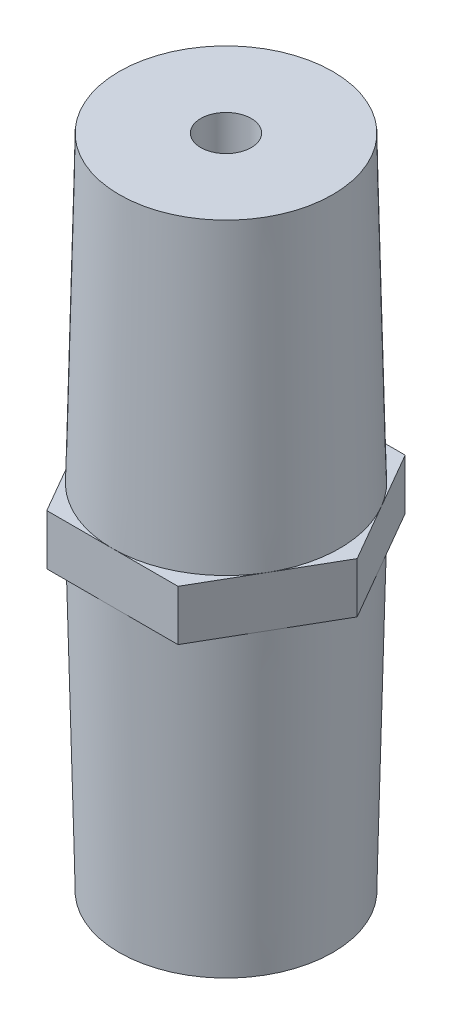
ISO-10303-21;
HEADER;
FILE_DESCRIPTION(('STEP AP214'),'2;1');
FILE_NAME('part.step','',(''),(''),'','','');
FILE_SCHEMA(('AUTOMOTIVE_DESIGN { 1 0 10303 214 1 1 1 1 }'));
ENDSEC;
DATA;
#1=APPLICATION_CONTEXT('core data for automotive mechanical design processes');
#2=APPLICATION_PROTOCOL_DEFINITION('international standard','automotive_design',2000,#1);
#3=PRODUCT_CONTEXT('',#1,'mechanical');
#4=PRODUCT('Part','Part','',(#3));
#5=PRODUCT_RELATED_PRODUCT_CATEGORY('part','',(#4));
#6=PRODUCT_DEFINITION_FORMATION('','',#4);
#7=PRODUCT_DEFINITION_CONTEXT('part definition',#1,'design');
#8=PRODUCT_DEFINITION('design','',#6,#7);
#9=PRODUCT_DEFINITION_SHAPE('','',#8);
#10=(LENGTH_UNIT() NAMED_UNIT(*) SI_UNIT(.MILLI.,.METRE.));
#11=(NAMED_UNIT(*) PLANE_ANGLE_UNIT() SI_UNIT($,.RADIAN.));
#12=(NAMED_UNIT(*) SI_UNIT($,.STERADIAN.) SOLID_ANGLE_UNIT());
#13=UNCERTAINTY_MEASURE_WITH_UNIT(LENGTH_MEASURE(1.E-05),#10,'distance_accuracy_value','');
#14=(GEOMETRIC_REPRESENTATION_CONTEXT(3) GLOBAL_UNCERTAINTY_ASSIGNED_CONTEXT((#13)) GLOBAL_UNIT_ASSIGNED_CONTEXT((#10,
#11,#12)) REPRESENTATION_CONTEXT('',''));
#15=CARTESIAN_POINT('',(0.,0.,0.));
#16=DIRECTION('',(0.,0.,1.));
#17=DIRECTION('',(1.,0.,0.));
#18=AXIS2_PLACEMENT_3D('',#15,#16,#17);
#19=CARTESIAN_POINT('',(0.,-1.5875,0.));
#20=DIRECTION('',(0.,-1.,0.));
#21=DIRECTION('',(0.,0.,1.));
#22=AXIS2_PLACEMENT_3D('',#19,#20,#21);
#23=PLANE('',#22);
#24=DIRECTION('',(1.,0.,0.));
#25=VECTOR('',#24,1.);
#26=CARTESIAN_POINT('',(-4.12444598552339,-1.5875,7.14375));
#27=LINE('',#26,#25);
#28=CARTESIAN_POINT('',(0.,-1.5875,7.14375));
#29=VERTEX_POINT('',#28);
#30=CARTESIAN_POINT('',(4.12444598552339,-1.5875,7.14375));
#31=VERTEX_POINT('',#30);
#32=EDGE_CURVE('E139',#29,#31,#27,.T.);
#33=ORIENTED_EDGE('',*,*,#32,.F.);
#34=CARTESIAN_POINT('',(0.,-1.5875,0.));
#35=DIRECTION('',(0.,1.,0.));
#36=DIRECTION('',(0.,0.,1.));
#37=AXIS2_PLACEMENT_3D('',#34,#35,#36);
#38=CIRCLE('',#37,7.14375);
#39=CARTESIAN_POINT('',(6.18666897828508,-1.5875,3.571875));
#40=VERTEX_POINT('',#39);
#41=EDGE_CURVE('E51',#29,#40,#38,.T.);
#42=ORIENTED_EDGE('',*,*,#41,.T.);
#43=DIRECTION('',(0.5,0.,-0.866025403784439));
#44=VECTOR('',#43,1.);
#45=CARTESIAN_POINT('',(4.12444598552339,-1.5875,7.14375));
#46=LINE('',#45,#44);
#47=EDGE_CURVE('E138',#31,#40,#46,.T.);
#48=ORIENTED_EDGE('',*,*,#47,.F.);
#49=EDGE_LOOP('',(#33,#42,#48));
#50=FACE_BOUND('',#49,.T.);
#51=ADVANCED_FACE('F39',(#50),#23,.T.);
#52=CARTESIAN_POINT('',(8.24889197104678,-1.5875,0.));
#53=VERTEX_POINT('',#52);
#54=EDGE_CURVE('E145',#40,#53,#46,.T.);
#55=ORIENTED_EDGE('',*,*,#54,.F.);
#56=CARTESIAN_POINT('',(6.18666897828508,-1.5875,-3.571875));
#57=VERTEX_POINT('',#56);
#58=EDGE_CURVE('E11',#40,#57,#38,.T.);
#59=ORIENTED_EDGE('',*,*,#58,.T.);
#60=DIRECTION('',(-0.5,0.,-0.866025403784439));
#61=VECTOR('',#60,1.);
#62=CARTESIAN_POINT('',(8.24889197104678,-1.5875,0.));
#63=LINE('',#62,#61);
#64=EDGE_CURVE('E148',#53,#57,#63,.T.);
#65=ORIENTED_EDGE('',*,*,#64,.F.);
#66=EDGE_LOOP('',(#55,#59,#65));
#67=FACE_BOUND('',#66,.T.);
#68=ADVANCED_FACE('F146',(#67),#23,.T.);
#69=CARTESIAN_POINT('',(4.12444598552339,-1.5875,-7.14375));
#70=VERTEX_POINT('',#69);
#71=EDGE_CURVE('E180',#57,#70,#63,.T.);
#72=ORIENTED_EDGE('',*,*,#71,.F.);
#73=CARTESIAN_POINT('',(0.,-1.5875,-7.14375));
#74=VERTEX_POINT('',#73);
#75=EDGE_CURVE('E49',#57,#74,#38,.T.);
#76=ORIENTED_EDGE('',*,*,#75,.T.);
#77=DIRECTION('',(-1.,0.,0.));
#78=VECTOR('',#77,1.);
#79=CARTESIAN_POINT('',(4.12444598552339,-1.5875,-7.14375));
#80=LINE('',#79,#78);
#81=EDGE_CURVE('E176',#70,#74,#80,.T.);
#82=ORIENTED_EDGE('',*,*,#81,.F.);
#83=EDGE_LOOP('',(#72,#76,#82));
#84=FACE_BOUND('',#83,.T.);
#85=ADVANCED_FACE('F331',(#84),#23,.T.);
#86=CARTESIAN_POINT('',(-4.12444598552339,-1.5875,-7.14375));
#87=VERTEX_POINT('',#86);
#88=EDGE_CURVE('E175',#74,#87,#80,.T.);
#89=ORIENTED_EDGE('',*,*,#88,.F.);
#90=CARTESIAN_POINT('',(-6.18666897828508,-1.5875,-3.571875));
#91=VERTEX_POINT('',#90);
#92=EDGE_CURVE('E264',#74,#91,#38,.T.);
#93=ORIENTED_EDGE('',*,*,#92,.T.);
#94=DIRECTION('',(-0.5,0.,0.866025403784439));
#95=VECTOR('',#94,1.);
#96=CARTESIAN_POINT('',(-4.12444598552339,-1.5875,-7.14375));
#97=LINE('',#96,#95);
#98=EDGE_CURVE('E171',#87,#91,#97,.T.);
#99=ORIENTED_EDGE('',*,*,#98,.F.);
#100=EDGE_LOOP('',(#89,#93,#99));
#101=FACE_BOUND('',#100,.T.);
#102=ADVANCED_FACE('F323',(#101),#23,.T.);
#103=CARTESIAN_POINT('',(-8.24889197104677,-1.5875,0.));
#104=VERTEX_POINT('',#103);
#105=EDGE_CURVE('E170',#91,#104,#97,.T.);
#106=ORIENTED_EDGE('',*,*,#105,.F.);
#107=CARTESIAN_POINT('',(-6.18666897828508,-1.5875,3.571875));
#108=VERTEX_POINT('',#107);
#109=EDGE_CURVE('E258',#91,#108,#38,.T.);
#110=ORIENTED_EDGE('',*,*,#109,.T.);
#111=DIRECTION('',(0.5,0.,0.866025403784439));
#112=VECTOR('',#111,1.);
#113=CARTESIAN_POINT('',(-8.24889197104677,-1.5875,0.));
#114=LINE('',#113,#112);
#115=EDGE_CURVE('E166',#104,#108,#114,.T.);
#116=ORIENTED_EDGE('',*,*,#115,.F.);
#117=EDGE_LOOP('',(#106,#110,#116));
#118=FACE_BOUND('',#117,.T.);
#119=ADVANCED_FACE('F315',(#118),#23,.T.);
#120=CARTESIAN_POINT('',(0.,1.5875,0.));
#121=DIRECTION('',(0.,1.,0.));
#122=DIRECTION('',(0.,0.,1.));
#123=AXIS2_PLACEMENT_3D('',#120,#121,#122);
#124=PLANE('',#123);
#125=CARTESIAN_POINT('',(0.,1.5875,0.));
#126=DIRECTION('',(0.,1.,0.));
#127=DIRECTION('',(0.,0.,1.));
#128=AXIS2_PLACEMENT_3D('',#125,#126,#127);
#129=CIRCLE('',#128,7.14375);
#130=CARTESIAN_POINT('',(0.,1.5875,7.14375));
#131=VERTEX_POINT('',#130);
#132=CARTESIAN_POINT('',(6.18666897828508,1.5875,3.571875));
#133=VERTEX_POINT('',#132);
#134=EDGE_CURVE('E183',#131,#133,#129,.T.);
#135=ORIENTED_EDGE('',*,*,#134,.F.);
#136=DIRECTION('',(1.,0.,0.));
#137=VECTOR('',#136,1.);
#138=CARTESIAN_POINT('',(-4.12444598552339,1.5875,7.14375));
#139=LINE('',#138,#137);
#140=CARTESIAN_POINT('',(4.12444598552339,1.5875,7.14375));
#141=VERTEX_POINT('',#140);
#142=EDGE_CURVE('E217',#131,#141,#139,.T.);
#143=ORIENTED_EDGE('',*,*,#142,.T.);
#144=DIRECTION('',(0.5,0.,-0.866025403784439));
#145=VECTOR('',#144,1.);
#146=CARTESIAN_POINT('',(4.12444598552339,1.5875,7.14375));
#147=LINE('',#146,#145);
#148=EDGE_CURVE('E193',#141,#133,#147,.T.);
#149=ORIENTED_EDGE('',*,*,#148,.T.);
#150=EDGE_LOOP('',(#135,#143,#149));
#151=FACE_BOUND('',#150,.T.);
#152=ADVANCED_FACE('F296',(#151),#124,.T.);
#153=CARTESIAN_POINT('',(6.18666897828508,1.5875,-3.571875));
#154=VERTEX_POINT('',#153);
#155=EDGE_CURVE('E188',#133,#154,#129,.T.);
#156=ORIENTED_EDGE('',*,*,#155,.F.);
#157=CARTESIAN_POINT('',(8.24889197104678,1.5875,0.));
#158=VERTEX_POINT('',#157);
#159=EDGE_CURVE('E192',#133,#158,#147,.T.);
#160=ORIENTED_EDGE('',*,*,#159,.T.);
#161=DIRECTION('',(-0.5,0.,-0.866025403784439));
#162=VECTOR('',#161,1.);
#163=CARTESIAN_POINT('',(8.24889197104678,1.5875,0.));
#164=LINE('',#163,#162);
#165=EDGE_CURVE('E198',#158,#154,#164,.T.);
#166=ORIENTED_EDGE('',*,*,#165,.T.);
#167=EDGE_LOOP('',(#156,#160,#166));
#168=FACE_BOUND('',#167,.T.);
#169=ADVANCED_FACE('F329',(#168),#124,.T.);
#170=CARTESIAN_POINT('',(0.,1.5875,-7.14375));
#171=VERTEX_POINT('',#170);
#172=EDGE_CURVE('E252',#154,#171,#129,.T.);
#173=ORIENTED_EDGE('',*,*,#172,.F.);
#174=CARTESIAN_POINT('',(4.12444598552339,1.5875,-7.14375));
#175=VERTEX_POINT('',#174);
#176=EDGE_CURVE('E197',#154,#175,#164,.T.);
#177=ORIENTED_EDGE('',*,*,#176,.T.);
#178=DIRECTION('',(-1.,0.,0.));
#179=VECTOR('',#178,1.);
#180=CARTESIAN_POINT('',(4.12444598552339,1.5875,-7.14375));
#181=LINE('',#180,#179);
#182=EDGE_CURVE('E203',#175,#171,#181,.T.);
#183=ORIENTED_EDGE('',*,*,#182,.T.);
#184=EDGE_LOOP('',(#173,#177,#183));
#185=FACE_BOUND('',#184,.T.);
#186=ADVANCED_FACE('F369',(#185),#124,.T.);
#187=CARTESIAN_POINT('',(-6.18666897828508,1.5875,-3.571875));
#188=VERTEX_POINT('',#187);
#189=EDGE_CURVE('E249',#171,#188,#129,.T.);
#190=ORIENTED_EDGE('',*,*,#189,.F.);
#191=CARTESIAN_POINT('',(-4.12444598552339,1.5875,-7.14375));
#192=VERTEX_POINT('',#191);
#193=EDGE_CURVE('E202',#171,#192,#181,.T.);
#194=ORIENTED_EDGE('',*,*,#193,.T.);
#195=DIRECTION('',(-0.5,0.,0.866025403784439));
#196=VECTOR('',#195,1.);
#197=CARTESIAN_POINT('',(-4.12444598552339,1.5875,-7.14375));
#198=LINE('',#197,#196);
#199=EDGE_CURVE('E208',#192,#188,#198,.T.);
#200=ORIENTED_EDGE('',*,*,#199,.T.);
#201=EDGE_LOOP('',(#190,#194,#200));
#202=FACE_BOUND('',#201,.T.);
#203=ADVANCED_FACE('F364',(#202),#124,.T.);
#204=CARTESIAN_POINT('',(-6.18666897828508,1.5875,3.571875));
#205=VERTEX_POINT('',#204);
#206=EDGE_CURVE('E245',#188,#205,#129,.T.);
#207=ORIENTED_EDGE('',*,*,#206,.F.);
#208=CARTESIAN_POINT('',(-8.24889197104677,1.5875,0.));
#209=VERTEX_POINT('',#208);
#210=EDGE_CURVE('E207',#188,#209,#198,.T.);
#211=ORIENTED_EDGE('',*,*,#210,.T.);
#212=DIRECTION('',(0.5,0.,0.866025403784439));
#213=VECTOR('',#212,1.);
#214=CARTESIAN_POINT('',(-8.24889197104677,1.5875,0.));
#215=LINE('',#214,#213);
#216=EDGE_CURVE('E213',#209,#205,#215,.T.);
#217=ORIENTED_EDGE('',*,*,#216,.T.);
#218=EDGE_LOOP('',(#207,#211,#217));
#219=FACE_BOUND('',#218,.T.);
#220=ADVANCED_FACE('F353',(#219),#124,.T.);
#221=CARTESIAN_POINT('',(4.12444598552339,1.5875,7.14375));
#222=DIRECTION('',(-0.866025403784439,0.,-0.5));
#223=DIRECTION('',(-0.5,0.,0.866025403784439));
#224=AXIS2_PLACEMENT_3D('',#221,#222,#223);
#225=PLANE('',#224);
#226=DIRECTION('',(0.,-1.,0.));
#227=VECTOR('',#226,1.);
#228=CARTESIAN_POINT('',(4.12444598552339,1.5875,7.14375));
#229=LINE('',#228,#227);
#230=EDGE_CURVE('E157',#141,#31,#229,.T.);
#231=ORIENTED_EDGE('',*,*,#230,.T.);
#232=ORIENTED_EDGE('',*,*,#47,.T.);
#233=ORIENTED_EDGE('',*,*,#54,.T.);
#234=DIRECTION('',(0.,-1.,0.));
#235=VECTOR('',#234,1.);
#236=CARTESIAN_POINT('',(8.24889197104678,1.5875,0.));
#237=LINE('',#236,#235);
#238=EDGE_CURVE('E43',#158,#53,#237,.T.);
#239=ORIENTED_EDGE('',*,*,#238,.F.);
#240=ORIENTED_EDGE('',*,*,#159,.F.);
#241=ORIENTED_EDGE('',*,*,#148,.F.);
#242=EDGE_LOOP('',(#231,#232,#233,#239,#240,#241));
#243=FACE_BOUND('',#242,.T.);
#244=ADVANCED_FACE('F41',(#243),#225,.F.);
#245=CARTESIAN_POINT('',(8.24889197104678,1.5875,0.));
#246=DIRECTION('',(-0.866025403784439,0.,0.5));
#247=DIRECTION('',(0.5,0.,0.866025403784439));
#248=AXIS2_PLACEMENT_3D('',#245,#246,#247);
#249=PLANE('',#248);
#250=ORIENTED_EDGE('',*,*,#238,.T.);
#251=ORIENTED_EDGE('',*,*,#64,.T.);
#252=ORIENTED_EDGE('',*,*,#71,.T.);
#253=DIRECTION('',(0.,-1.,0.));
#254=VECTOR('',#253,1.);
#255=CARTESIAN_POINT('',(4.12444598552339,1.5875,-7.14375));
#256=LINE('',#255,#254);
#257=EDGE_CURVE('E234',#175,#70,#256,.T.);
#258=ORIENTED_EDGE('',*,*,#257,.F.);
#259=ORIENTED_EDGE('',*,*,#176,.F.);
#260=ORIENTED_EDGE('',*,*,#165,.F.);
#261=EDGE_LOOP('',(#250,#251,#252,#258,#259,#260));
#262=FACE_BOUND('',#261,.T.);
#263=ADVANCED_FACE('F345',(#262),#249,.F.);
#264=CARTESIAN_POINT('',(4.12444598552339,1.5875,-7.14375));
#265=DIRECTION('',(0.,0.,1.));
#266=DIRECTION('',(1.,0.,0.));
#267=AXIS2_PLACEMENT_3D('',#264,#265,#266);
#268=PLANE('',#267);
#269=ORIENTED_EDGE('',*,*,#257,.T.);
#270=ORIENTED_EDGE('',*,*,#81,.T.);
#271=ORIENTED_EDGE('',*,*,#88,.T.);
#272=DIRECTION('',(0.,-1.,0.));
#273=VECTOR('',#272,1.);
#274=CARTESIAN_POINT('',(-4.12444598552339,1.5875,-7.14375));
#275=LINE('',#274,#273);
#276=EDGE_CURVE('E231',#192,#87,#275,.T.);
#277=ORIENTED_EDGE('',*,*,#276,.F.);
#278=ORIENTED_EDGE('',*,*,#193,.F.);
#279=ORIENTED_EDGE('',*,*,#182,.F.);
#280=EDGE_LOOP('',(#269,#270,#271,#277,#278,#279));
#281=FACE_BOUND('',#280,.T.);
#282=ADVANCED_FACE('F347',(#281),#268,.F.);
#283=CARTESIAN_POINT('',(-4.12444598552339,1.5875,-7.14375));
#284=DIRECTION('',(0.866025403784439,0.,0.5));
#285=DIRECTION('',(0.5,0.,-0.866025403784439));
#286=AXIS2_PLACEMENT_3D('',#283,#284,#285);
#287=PLANE('',#286);
#288=ORIENTED_EDGE('',*,*,#276,.T.);
#289=ORIENTED_EDGE('',*,*,#98,.T.);
#290=ORIENTED_EDGE('',*,*,#105,.T.);
#291=DIRECTION('',(0.,-1.,0.));
#292=VECTOR('',#291,1.);
#293=CARTESIAN_POINT('',(-8.24889197104677,1.5875,0.));
#294=LINE('',#293,#292);
#295=EDGE_CURVE('E227',#209,#104,#294,.T.);
#296=ORIENTED_EDGE('',*,*,#295,.F.);
#297=ORIENTED_EDGE('',*,*,#210,.F.);
#298=ORIENTED_EDGE('',*,*,#199,.F.);
#299=EDGE_LOOP('',(#288,#289,#290,#296,#297,#298));
#300=FACE_BOUND('',#299,.T.);
#301=ADVANCED_FACE('F337',(#300),#287,.F.);
#302=CARTESIAN_POINT('',(-8.24889197104677,1.5875,0.));
#303=DIRECTION('',(0.866025403784439,0.,-0.5));
#304=DIRECTION('',(-0.5,0.,-0.866025403784439));
#305=AXIS2_PLACEMENT_3D('',#302,#303,#304);
#306=PLANE('',#305);
#307=ORIENTED_EDGE('',*,*,#295,.T.);
#308=ORIENTED_EDGE('',*,*,#115,.T.);
#309=CARTESIAN_POINT('',(-4.12444598552339,-1.5875,7.14375));
#310=VERTEX_POINT('',#309);
#311=EDGE_CURVE('E165',#108,#310,#114,.T.);
#312=ORIENTED_EDGE('',*,*,#311,.T.);
#313=DIRECTION('',(0.,-1.,0.));
#314=VECTOR('',#313,1.);
#315=CARTESIAN_POINT('',(-4.12444598552339,1.5875,7.14375));
#316=LINE('',#315,#314);
#317=CARTESIAN_POINT('',(-4.12444598552339,1.5875,7.14375));
#318=VERTEX_POINT('',#317);
#319=EDGE_CURVE('E223',#318,#310,#316,.T.);
#320=ORIENTED_EDGE('',*,*,#319,.F.);
#321=EDGE_CURVE('E212',#205,#318,#215,.T.);
#322=ORIENTED_EDGE('',*,*,#321,.F.);
#323=ORIENTED_EDGE('',*,*,#216,.F.);
#324=EDGE_LOOP('',(#307,#308,#312,#320,#322,#323));
#325=FACE_BOUND('',#324,.T.);
#326=ADVANCED_FACE('F308',(#325),#306,.F.);
#327=CARTESIAN_POINT('',(-4.12444598552339,1.5875,7.14375));
#328=DIRECTION('',(0.,0.,-1.));
#329=DIRECTION('',(-1.,0.,0.));
#330=AXIS2_PLACEMENT_3D('',#327,#328,#329);
#331=PLANE('',#330);
#332=ORIENTED_EDGE('',*,*,#319,.T.);
#333=EDGE_CURVE('E160',#310,#29,#27,.T.);
#334=ORIENTED_EDGE('',*,*,#333,.T.);
#335=ORIENTED_EDGE('',*,*,#32,.T.);
#336=ORIENTED_EDGE('',*,*,#230,.F.);
#337=ORIENTED_EDGE('',*,*,#142,.F.);
#338=EDGE_CURVE('E218',#318,#131,#139,.T.);
#339=ORIENTED_EDGE('',*,*,#338,.F.);
#340=EDGE_LOOP('',(#332,#334,#335,#336,#337,#339));
#341=FACE_BOUND('',#340,.T.);
#342=ADVANCED_FACE('F312',(#341),#331,.F.);
#343=EDGE_CURVE('E65',#205,#131,#129,.T.);
#344=ORIENTED_EDGE('',*,*,#343,.F.);
#345=ORIENTED_EDGE('',*,*,#321,.T.);
#346=ORIENTED_EDGE('',*,*,#338,.T.);
#347=EDGE_LOOP('',(#344,#345,#346));
#348=FACE_BOUND('',#347,.T.);
#349=ADVANCED_FACE('F292',(#348),#124,.T.);
#350=CARTESIAN_POINT('',(0.,1.5875,0.));
#351=DIRECTION('',(0.,-1.,0.));
#352=DIRECTION('',(0.,0.,1.));
#353=AXIS2_PLACEMENT_3D('',#350,#351,#352);
#354=CONICAL_SURFACE('',#353,7.14375,0.0226892802759263);
#355=CARTESIAN_POINT('',(0.,20.6375,0.));
#356=DIRECTION('',(0.,1.,0.));
#357=DIRECTION('',(0.,0.,1.));
#358=AXIS2_PLACEMENT_3D('',#355,#356,#357);
#359=CIRCLE('',#358,6.71144502416799);
#360=CARTESIAN_POINT('',(0.,20.6375,6.71144502416799));
#361=VERTEX_POINT('',#360);
#362=EDGE_CURVE('E187',#361,#361,#359,.T.);
#363=ORIENTED_EDGE('',*,*,#362,.F.);
#364=EDGE_LOOP('',(#363));
#365=FACE_BOUND('',#364,.T.);
#366=ORIENTED_EDGE('',*,*,#134,.T.);
#367=ORIENTED_EDGE('',*,*,#155,.T.);
#368=ORIENTED_EDGE('',*,*,#172,.T.);
#369=ORIENTED_EDGE('',*,*,#189,.T.);
#370=ORIENTED_EDGE('',*,*,#206,.T.);
#371=ORIENTED_EDGE('',*,*,#343,.T.);
#372=EDGE_LOOP('',(#366,#367,#368,#369,#370,#371));
#373=FACE_BOUND('',#372,.T.);
#374=ADVANCED_FACE('F287',(#365,#373),#354,.T.);
#375=CARTESIAN_POINT('',(0.,20.6375,0.));
#376=DIRECTION('',(0.,1.,0.));
#377=DIRECTION('',(0.,0.,1.));
#378=AXIS2_PLACEMENT_3D('',#375,#376,#377);
#379=PLANE('',#378);
#380=CARTESIAN_POINT('',(0.,20.6375,0.));
#381=DIRECTION('',(0.,1.,0.));
#382=DIRECTION('',(0.,0.,1.));
#383=AXIS2_PLACEMENT_3D('',#380,#381,#382);
#384=CIRCLE('',#383,1.5875);
#385=CARTESIAN_POINT('',(0.,20.6375,1.5875));
#386=VERTEX_POINT('',#385);
#387=EDGE_CURVE('E266',#386,#386,#384,.T.);
#388=ORIENTED_EDGE('',*,*,#387,.F.);
#389=EDGE_LOOP('',(#388));
#390=FACE_BOUND('',#389,.T.);
#391=ORIENTED_EDGE('',*,*,#362,.T.);
#392=EDGE_LOOP('',(#391));
#393=FACE_BOUND('',#392,.T.);
#394=ADVANCED_FACE('F283',(#390,#393),#379,.T.);
#395=ORIENTED_EDGE('',*,*,#311,.F.);
#396=EDGE_CURVE('E144',#108,#29,#38,.T.);
#397=ORIENTED_EDGE('',*,*,#396,.T.);
#398=ORIENTED_EDGE('',*,*,#333,.F.);
#399=EDGE_LOOP('',(#395,#397,#398));
#400=FACE_BOUND('',#399,.T.);
#401=ADVANCED_FACE('F286',(#400),#23,.T.);
#402=CARTESIAN_POINT('',(0.,-1.5875,0.));
#403=DIRECTION('',(0.,1.,0.));
#404=DIRECTION('',(0.,0.,1.));
#405=AXIS2_PLACEMENT_3D('',#402,#403,#404);
#406=CONICAL_SURFACE('',#405,7.14375,0.0226892802759263);
#407=CARTESIAN_POINT('',(0.,-20.6375,0.));
#408=DIRECTION('',(0.,-1.,0.));
#409=DIRECTION('',(0.,0.,-1.));
#410=AXIS2_PLACEMENT_3D('',#407,#408,#409);
#411=CIRCLE('',#410,6.71144502416799);
#412=CARTESIAN_POINT('',(0.,-20.6375,-6.71144502416799));
#413=VERTEX_POINT('',#412);
#414=EDGE_CURVE('E142',#413,#413,#411,.F.);
#415=ORIENTED_EDGE('',*,*,#414,.T.);
#416=EDGE_LOOP('',(#415));
#417=FACE_BOUND('',#416,.T.);
#418=ORIENTED_EDGE('',*,*,#41,.F.);
#419=ORIENTED_EDGE('',*,*,#396,.F.);
#420=ORIENTED_EDGE('',*,*,#109,.F.);
#421=ORIENTED_EDGE('',*,*,#92,.F.);
#422=ORIENTED_EDGE('',*,*,#75,.F.);
#423=ORIENTED_EDGE('',*,*,#58,.F.);
#424=EDGE_LOOP('',(#418,#419,#420,#421,#422,#423));
#425=FACE_BOUND('',#424,.T.);
#426=ADVANCED_FACE('F128',(#417,#425),#406,.T.);
#427=CARTESIAN_POINT('',(0.,-20.6375,0.));
#428=DIRECTION('',(0.,-1.,0.));
#429=DIRECTION('',(0.,0.,1.));
#430=AXIS2_PLACEMENT_3D('',#427,#428,#429);
#431=PLANE('',#430);
#432=CARTESIAN_POINT('',(0.,-20.6375,0.));
#433=DIRECTION('',(0.,1.,0.));
#434=DIRECTION('',(0.,0.,1.));
#435=AXIS2_PLACEMENT_3D('',#432,#433,#434);
#436=CIRCLE('',#435,1.5875);
#437=CARTESIAN_POINT('',(0.,-20.6375,1.5875));
#438=VERTEX_POINT('',#437);
#439=EDGE_CURVE('E143',#438,#438,#436,.T.);
#440=ORIENTED_EDGE('',*,*,#439,.T.);
#441=EDGE_LOOP('',(#440));
#442=FACE_BOUND('',#441,.T.);
#443=ORIENTED_EDGE('',*,*,#414,.F.);
#444=EDGE_LOOP('',(#443));
#445=FACE_BOUND('',#444,.T.);
#446=ADVANCED_FACE('F274',(#442,#445),#431,.T.);
#447=CARTESIAN_POINT('',(0.,-20.6375,0.));
#448=DIRECTION('',(0.,1.,0.));
#449=DIRECTION('',(0.,0.,1.));
#450=AXIS2_PLACEMENT_3D('',#447,#448,#449);
#451=CYLINDRICAL_SURFACE('',#450,1.5875);
#452=ORIENTED_EDGE('',*,*,#439,.F.);
#453=EDGE_LOOP('',(#452));
#454=FACE_BOUND('',#453,.T.);
#455=ORIENTED_EDGE('',*,*,#387,.T.);
#456=EDGE_LOOP('',(#455));
#457=FACE_BOUND('',#456,.T.);
#458=ADVANCED_FACE('F277',(#454,#457),#451,.F.);
#459=CLOSED_SHELL('',(#51,#68,#85,#102,#119,#152,#169,#186,#203,#220,#244,#263,#282,#301,#326,
#342,#349,#374,#394,#401,#426,#446,#458));
#460=MANIFOLD_SOLID_BREP('B2',#459);
#461=ADVANCED_BREP_SHAPE_REPRESENTATION('',(#18,#460),#14);
#462=SHAPE_DEFINITION_REPRESENTATION(#9,#461);
ENDSEC;
END-ISO-10303-21;
